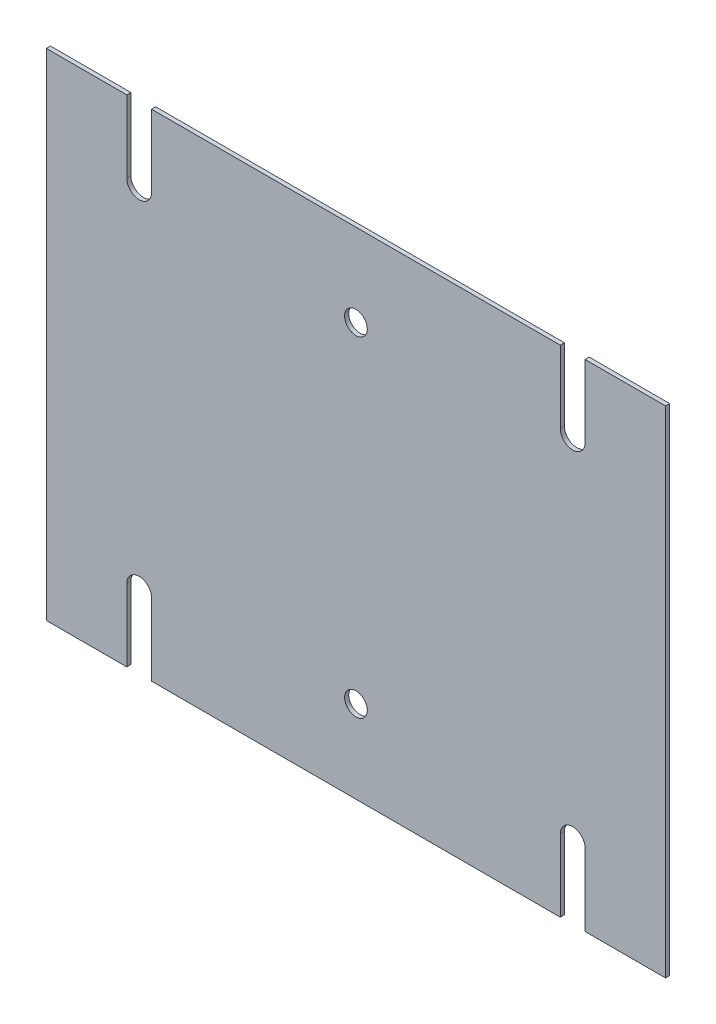
ISO-10303-21;
HEADER;
FILE_DESCRIPTION(('STEP AP214'),'2;1');
FILE_NAME('part.step','',(''),(''),'','','');
FILE_SCHEMA(('AUTOMOTIVE_DESIGN { 1 0 10303 214 1 1 1 1 }'));
ENDSEC;
DATA;
#1=APPLICATION_CONTEXT('core data for automotive mechanical design processes');
#2=APPLICATION_PROTOCOL_DEFINITION('international standard','automotive_design',2000,#1);
#3=PRODUCT_CONTEXT('',#1,'mechanical');
#4=PRODUCT('Part','Part','',(#3));
#5=PRODUCT_RELATED_PRODUCT_CATEGORY('part','',(#4));
#6=PRODUCT_DEFINITION_FORMATION('','',#4);
#7=PRODUCT_DEFINITION_CONTEXT('part definition',#1,'design');
#8=PRODUCT_DEFINITION('design','',#6,#7);
#9=PRODUCT_DEFINITION_SHAPE('','',#8);
#10=(LENGTH_UNIT() NAMED_UNIT(*) SI_UNIT(.MILLI.,.METRE.));
#11=(NAMED_UNIT(*) PLANE_ANGLE_UNIT() SI_UNIT($,.RADIAN.));
#12=(NAMED_UNIT(*) SI_UNIT($,.STERADIAN.) SOLID_ANGLE_UNIT());
#13=UNCERTAINTY_MEASURE_WITH_UNIT(LENGTH_MEASURE(1.E-05),#10,'distance_accuracy_value','');
#14=(GEOMETRIC_REPRESENTATION_CONTEXT(3) GLOBAL_UNCERTAINTY_ASSIGNED_CONTEXT((#13)) GLOBAL_UNIT_ASSIGNED_CONTEXT((#10,
#11,#12)) REPRESENTATION_CONTEXT('',''));
#15=CARTESIAN_POINT('',(0.,0.,0.));
#16=DIRECTION('',(0.,0.,1.));
#17=DIRECTION('',(1.,0.,0.));
#18=AXIS2_PLACEMENT_3D('',#15,#16,#17);
#19=CARTESIAN_POINT('',(23.9488218182788,-146.633764285917,2.));
#20=DIRECTION('',(0.,0.,1.));
#21=DIRECTION('',(1.,0.,0.));
#22=AXIS2_PLACEMENT_3D('',#19,#20,#21);
#23=PLANE('',#22);
#24=DIRECTION('',(0.,-1.,0.));
#25=VECTOR('',#24,1.);
#26=CARTESIAN_POINT('',(-231.051178181721,58.3662357140828,2.));
#27=LINE('',#26,#25);
#28=CARTESIAN_POINT('',(-231.051178181721,58.3662357140828,2.));
#29=VERTEX_POINT('',#28);
#30=CARTESIAN_POINT('',(-231.051178181721,-181.633764285917,2.));
#31=VERTEX_POINT('',#30);
#32=EDGE_CURVE('E330',#29,#31,#27,.T.);
#33=ORIENTED_EDGE('',*,*,#32,.T.);
#34=DIRECTION('',(1.,0.,0.));
#35=VECTOR('',#34,1.);
#36=CARTESIAN_POINT('',(-192.051178181721,-181.633764285917,2.));
#37=LINE('',#36,#35);
#38=CARTESIAN_POINT('',(-192.051178181721,-181.633764285917,2.));
#39=VERTEX_POINT('',#38);
#40=EDGE_CURVE('E332',#31,#39,#37,.T.);
#41=ORIENTED_EDGE('',*,*,#40,.T.);
#42=DIRECTION('',(0.,1.,0.));
#43=VECTOR('',#42,1.);
#44=CARTESIAN_POINT('',(-192.051178181721,-181.633764285917,2.));
#45=LINE('',#44,#43);
#46=CARTESIAN_POINT('',(-192.051178181721,-146.633764285917,2.));
#47=VERTEX_POINT('',#46);
#48=EDGE_CURVE('E334',#39,#47,#45,.T.);
#49=ORIENTED_EDGE('',*,*,#48,.T.);
#50=CARTESIAN_POINT('',(-186.051178181721,-146.633764285917,2.));
#51=DIRECTION('',(0.,0.,-1.));
#52=DIRECTION('',(1.,0.,0.));
#53=AXIS2_PLACEMENT_3D('',#50,#51,#52);
#54=CIRCLE('',#53,6.00000000000001);
#55=CARTESIAN_POINT('',(-180.051178181721,-146.633764285917,2.));
#56=VERTEX_POINT('',#55);
#57=EDGE_CURVE('E336',#47,#56,#54,.T.);
#58=ORIENTED_EDGE('',*,*,#57,.T.);
#59=DIRECTION('',(0.,-1.,0.));
#60=VECTOR('',#59,1.);
#61=CARTESIAN_POINT('',(-180.051178181721,-181.633764285917,2.));
#62=LINE('',#61,#60);
#63=CARTESIAN_POINT('',(-180.051178181721,-181.633764285917,2.));
#64=VERTEX_POINT('',#63);
#65=EDGE_CURVE('E338',#56,#64,#62,.T.);
#66=ORIENTED_EDGE('',*,*,#65,.T.);
#67=DIRECTION('',(1.,0.,0.));
#68=VECTOR('',#67,1.);
#69=CARTESIAN_POINT('',(17.9488218182788,-181.633764285917,2.));
#70=LINE('',#69,#68);
#71=CARTESIAN_POINT('',(17.9488218182788,-181.633764285917,2.));
#72=VERTEX_POINT('',#71);
#73=EDGE_CURVE('E340',#64,#72,#70,.T.);
#74=ORIENTED_EDGE('',*,*,#73,.T.);
#75=DIRECTION('',(0.,1.,0.));
#76=VECTOR('',#75,1.);
#77=CARTESIAN_POINT('',(17.9488218182788,-146.633764285917,2.));
#78=LINE('',#77,#76);
#79=CARTESIAN_POINT('',(17.9488218182788,-146.633764285917,2.));
#80=VERTEX_POINT('',#79);
#81=EDGE_CURVE('E187',#72,#80,#78,.T.);
#82=ORIENTED_EDGE('',*,*,#81,.T.);
#83=CARTESIAN_POINT('',(23.9488218182788,-146.633764285917,2.));
#84=DIRECTION('',(0.,0.,-1.));
#85=DIRECTION('',(1.,0.,0.));
#86=AXIS2_PLACEMENT_3D('',#83,#84,#85);
#87=CIRCLE('',#86,6.00000000000001);
#88=CARTESIAN_POINT('',(29.9488218182788,-146.633764285917,2.));
#89=VERTEX_POINT('',#88);
#90=EDGE_CURVE('E181',#80,#89,#87,.T.);
#91=ORIENTED_EDGE('',*,*,#90,.T.);
#92=DIRECTION('',(0.,-1.,0.));
#93=VECTOR('',#92,1.);
#94=CARTESIAN_POINT('',(29.9488218182788,-146.633764285917,2.));
#95=LINE('',#94,#93);
#96=CARTESIAN_POINT('',(29.9488218182788,-181.633764285917,2.));
#97=VERTEX_POINT('',#96);
#98=EDGE_CURVE('E185',#89,#97,#95,.T.);
#99=ORIENTED_EDGE('',*,*,#98,.T.);
#100=DIRECTION('',(1.,0.,0.));
#101=VECTOR('',#100,1.);
#102=CARTESIAN_POINT('',(68.9488218182788,-181.633764285917,2.));
#103=LINE('',#102,#101);
#104=CARTESIAN_POINT('',(68.9488218182788,-181.633764285917,2.));
#105=VERTEX_POINT('',#104);
#106=EDGE_CURVE('E201',#97,#105,#103,.T.);
#107=ORIENTED_EDGE('',*,*,#106,.T.);
#108=DIRECTION('',(0.,1.,0.));
#109=VECTOR('',#108,1.);
#110=CARTESIAN_POINT('',(68.9488218182787,58.3662357140828,2.));
#111=LINE('',#110,#109);
#112=CARTESIAN_POINT('',(68.9488218182787,58.3662357140828,2.));
#113=VERTEX_POINT('',#112);
#114=EDGE_CURVE('E51',#105,#113,#111,.T.);
#115=ORIENTED_EDGE('',*,*,#114,.T.);
#116=DIRECTION('',(-1.,0.,0.));
#117=VECTOR('',#116,1.);
#118=CARTESIAN_POINT('',(68.9488218182787,58.3662357140828,2.));
#119=LINE('',#118,#117);
#120=CARTESIAN_POINT('',(29.9488218182788,58.3662357140828,2.));
#121=VERTEX_POINT('',#120);
#122=EDGE_CURVE('E131',#113,#121,#119,.T.);
#123=ORIENTED_EDGE('',*,*,#122,.T.);
#124=DIRECTION('',(0.,-1.,0.));
#125=VECTOR('',#124,1.);
#126=CARTESIAN_POINT('',(29.9488218182788,58.3662357140828,2.));
#127=LINE('',#126,#125);
#128=CARTESIAN_POINT('',(29.9488218182787,23.3662357140828,2.));
#129=VERTEX_POINT('',#128);
#130=EDGE_CURVE('E296',#121,#129,#127,.T.);
#131=ORIENTED_EDGE('',*,*,#130,.T.);
#132=CARTESIAN_POINT('',(23.9488218182787,23.3662357140828,2.));
#133=DIRECTION('',(0.,0.,-1.));
#134=DIRECTION('',(1.,0.,0.));
#135=AXIS2_PLACEMENT_3D('',#132,#133,#134);
#136=CIRCLE('',#135,6.);
#137=CARTESIAN_POINT('',(17.9488218182787,23.3662357140828,2.));
#138=VERTEX_POINT('',#137);
#139=EDGE_CURVE('E316',#129,#138,#136,.T.);
#140=ORIENTED_EDGE('',*,*,#139,.T.);
#141=DIRECTION('',(0.,1.,0.));
#142=VECTOR('',#141,1.);
#143=CARTESIAN_POINT('',(17.9488218182788,58.3662357140828,2.));
#144=LINE('',#143,#142);
#145=CARTESIAN_POINT('',(17.9488218182788,58.3662357140828,2.));
#146=VERTEX_POINT('',#145);
#147=EDGE_CURVE('E313',#138,#146,#144,.T.);
#148=ORIENTED_EDGE('',*,*,#147,.T.);
#149=DIRECTION('',(-1.,0.,0.));
#150=VECTOR('',#149,1.);
#151=CARTESIAN_POINT('',(17.9488218182788,58.3662357140828,2.));
#152=LINE('',#151,#150);
#153=CARTESIAN_POINT('',(-180.051178181721,58.3662357140828,2.));
#154=VERTEX_POINT('',#153);
#155=EDGE_CURVE('E315',#146,#154,#152,.T.);
#156=ORIENTED_EDGE('',*,*,#155,.T.);
#157=DIRECTION('',(0.,-1.,0.));
#158=VECTOR('',#157,1.);
#159=CARTESIAN_POINT('',(-180.051178181721,58.3662357140828,2.));
#160=LINE('',#159,#158);
#161=CARTESIAN_POINT('',(-180.051178181721,23.3662357140828,2.));
#162=VERTEX_POINT('',#161);
#163=EDGE_CURVE('E318',#154,#162,#160,.T.);
#164=ORIENTED_EDGE('',*,*,#163,.T.);
#165=CARTESIAN_POINT('',(-186.051178181721,23.3662357140828,2.));
#166=DIRECTION('',(0.,0.,-1.));
#167=DIRECTION('',(1.,0.,0.));
#168=AXIS2_PLACEMENT_3D('',#165,#166,#167);
#169=CIRCLE('',#168,5.99999999999996);
#170=CARTESIAN_POINT('',(-192.051178181721,23.3662357140828,2.));
#171=VERTEX_POINT('',#170);
#172=EDGE_CURVE('E324',#162,#171,#169,.T.);
#173=ORIENTED_EDGE('',*,*,#172,.T.);
#174=DIRECTION('',(0.,1.,0.));
#175=VECTOR('',#174,1.);
#176=CARTESIAN_POINT('',(-192.051178181721,58.3662357140828,2.));
#177=LINE('',#176,#175);
#178=CARTESIAN_POINT('',(-192.051178181721,58.3662357140828,2.));
#179=VERTEX_POINT('',#178);
#180=EDGE_CURVE('E326',#171,#179,#177,.T.);
#181=ORIENTED_EDGE('',*,*,#180,.T.);
#182=DIRECTION('',(-1.,0.,0.));
#183=VECTOR('',#182,1.);
#184=CARTESIAN_POINT('',(-192.051178181721,58.3662357140828,2.));
#185=LINE('',#184,#183);
#186=EDGE_CURVE('E328',#179,#29,#185,.T.);
#187=ORIENTED_EDGE('',*,*,#186,.T.);
#188=EDGE_LOOP('',(#33,#41,#49,#58,#66,#74,#82,#91,#99,#107,#115,#123,#131,#140,#148,#156,#164,
#173,#181,#187));
#189=FACE_BOUND('',#188,.T.);
#190=CARTESIAN_POINT('',(-81.0511781817212,-141.633764285917,2.));
#191=DIRECTION('',(0.,0.,1.));
#192=DIRECTION('',(1.,0.,0.));
#193=AXIS2_PLACEMENT_3D('',#190,#191,#192);
#194=CIRCLE('',#193,5.5);
#195=CARTESIAN_POINT('',(-75.5511781817212,-141.633764285917,2.));
#196=VERTEX_POINT('',#195);
#197=EDGE_CURVE('E210',#196,#196,#194,.T.);
#198=ORIENTED_EDGE('',*,*,#197,.F.);
#199=EDGE_LOOP('',(#198));
#200=FACE_BOUND('',#199,.T.);
#201=CARTESIAN_POINT('',(-81.0511781817213,18.3662357140828,2.));
#202=DIRECTION('',(0.,0.,1.));
#203=DIRECTION('',(1.,0.,0.));
#204=AXIS2_PLACEMENT_3D('',#201,#202,#203);
#205=CIRCLE('',#204,5.5);
#206=CARTESIAN_POINT('',(-75.5511781817212,18.3662357140828,2.));
#207=VERTEX_POINT('',#206);
#208=EDGE_CURVE('E359',#207,#207,#205,.T.);
#209=ORIENTED_EDGE('',*,*,#208,.F.);
#210=EDGE_LOOP('',(#209));
#211=FACE_BOUND('',#210,.T.);
#212=ADVANCED_FACE('F34',(#189,#200,#211),#23,.T.);
#213=CARTESIAN_POINT('',(23.9488218182788,-146.633764285917,0.));
#214=DIRECTION('',(0.,0.,1.));
#215=DIRECTION('',(1.,0.,0.));
#216=AXIS2_PLACEMENT_3D('',#213,#214,#215);
#217=PLANE('',#216);
#218=DIRECTION('',(0.,-1.,0.));
#219=VECTOR('',#218,1.);
#220=CARTESIAN_POINT('',(-231.051178181721,-100.179856115108,0.));
#221=LINE('',#220,#219);
#222=CARTESIAN_POINT('',(-231.051178181721,58.3662357140828,0.));
#223=VERTEX_POINT('',#222);
#224=CARTESIAN_POINT('',(-231.051178181721,-181.633764285917,0.));
#225=VERTEX_POINT('',#224);
#226=EDGE_CURVE('E227',#223,#225,#221,.T.);
#227=ORIENTED_EDGE('',*,*,#226,.F.);
#228=DIRECTION('',(-1.,0.,0.));
#229=VECTOR('',#228,1.);
#230=CARTESIAN_POINT('',(-192.051178181721,58.3662357140828,0.));
#231=LINE('',#230,#229);
#232=CARTESIAN_POINT('',(-192.051178181721,58.3662357140828,0.));
#233=VERTEX_POINT('',#232);
#234=EDGE_CURVE('E224',#233,#223,#231,.T.);
#235=ORIENTED_EDGE('',*,*,#234,.F.);
#236=DIRECTION('',(0.,1.,0.));
#237=VECTOR('',#236,1.);
#238=CARTESIAN_POINT('',(-192.051178181721,58.3662357140828,0.));
#239=LINE('',#238,#237);
#240=CARTESIAN_POINT('',(-192.051178181721,23.3662357140828,0.));
#241=VERTEX_POINT('',#240);
#242=EDGE_CURVE('E222',#241,#233,#239,.T.);
#243=ORIENTED_EDGE('',*,*,#242,.F.);
#244=CARTESIAN_POINT('',(-186.051178181721,23.3662357140828,0.));
#245=DIRECTION('',(0.,0.,-1.));
#246=DIRECTION('',(1.,0.,0.));
#247=AXIS2_PLACEMENT_3D('',#244,#245,#246);
#248=CIRCLE('',#247,5.99999999999996);
#249=CARTESIAN_POINT('',(-180.051178181721,23.3662357140828,0.));
#250=VERTEX_POINT('',#249);
#251=EDGE_CURVE('E220',#250,#241,#248,.T.);
#252=ORIENTED_EDGE('',*,*,#251,.F.);
#253=DIRECTION('',(0.,-1.,0.));
#254=VECTOR('',#253,1.);
#255=CARTESIAN_POINT('',(-180.051178181721,58.3662357140828,0.));
#256=LINE('',#255,#254);
#257=CARTESIAN_POINT('',(-180.051178181721,58.3662357140828,0.));
#258=VERTEX_POINT('',#257);
#259=EDGE_CURVE('E218',#258,#250,#256,.T.);
#260=ORIENTED_EDGE('',*,*,#259,.F.);
#261=DIRECTION('',(-1.,0.,0.));
#262=VECTOR('',#261,1.);
#263=CARTESIAN_POINT('',(17.9488218182788,58.3662357140828,0.));
#264=LINE('',#263,#262);
#265=CARTESIAN_POINT('',(17.9488218182788,58.3662357140828,0.));
#266=VERTEX_POINT('',#265);
#267=EDGE_CURVE('E216',#266,#258,#264,.T.);
#268=ORIENTED_EDGE('',*,*,#267,.F.);
#269=DIRECTION('',(0.,1.,0.));
#270=VECTOR('',#269,1.);
#271=CARTESIAN_POINT('',(17.9488218182788,58.3662357140828,0.));
#272=LINE('',#271,#270);
#273=CARTESIAN_POINT('',(17.9488218182787,23.3662357140828,0.));
#274=VERTEX_POINT('',#273);
#275=EDGE_CURVE('E214',#274,#266,#272,.T.);
#276=ORIENTED_EDGE('',*,*,#275,.F.);
#277=CARTESIAN_POINT('',(23.9488218182787,23.3662357140828,0.));
#278=DIRECTION('',(0.,0.,-1.));
#279=DIRECTION('',(1.,0.,0.));
#280=AXIS2_PLACEMENT_3D('',#277,#278,#279);
#281=CIRCLE('',#280,6.);
#282=CARTESIAN_POINT('',(29.9488218182787,23.3662357140828,0.));
#283=VERTEX_POINT('',#282);
#284=EDGE_CURVE('E212',#283,#274,#281,.T.);
#285=ORIENTED_EDGE('',*,*,#284,.F.);
#286=DIRECTION('',(0.,-1.,0.));
#287=VECTOR('',#286,1.);
#288=CARTESIAN_POINT('',(29.9488218182788,58.3662357140828,0.));
#289=LINE('',#288,#287);
#290=CARTESIAN_POINT('',(29.9488218182788,58.3662357140828,0.));
#291=VERTEX_POINT('',#290);
#292=EDGE_CURVE('E209',#291,#283,#289,.T.);
#293=ORIENTED_EDGE('',*,*,#292,.F.);
#294=DIRECTION('',(-1.,0.,0.));
#295=VECTOR('',#294,1.);
#296=CARTESIAN_POINT('',(68.9488218182787,58.3662357140828,0.));
#297=LINE('',#296,#295);
#298=CARTESIAN_POINT('',(68.9488218182787,58.3662357140828,0.));
#299=VERTEX_POINT('',#298);
#300=EDGE_CURVE('E207',#299,#291,#297,.T.);
#301=ORIENTED_EDGE('',*,*,#300,.F.);
#302=DIRECTION('',(0.,1.,0.));
#303=VECTOR('',#302,1.);
#304=CARTESIAN_POINT('',(68.9488218182788,-96.6337642859173,0.));
#305=LINE('',#304,#303);
#306=CARTESIAN_POINT('',(68.9488218182788,-181.633764285917,0.));
#307=VERTEX_POINT('',#306);
#308=EDGE_CURVE('E244',#307,#299,#305,.T.);
#309=ORIENTED_EDGE('',*,*,#308,.F.);
#310=DIRECTION('',(1.,0.,0.));
#311=VECTOR('',#310,1.);
#312=CARTESIAN_POINT('',(68.9488218182788,-181.633764285917,0.));
#313=LINE('',#312,#311);
#314=CARTESIAN_POINT('',(29.9488218182788,-181.633764285917,0.));
#315=VERTEX_POINT('',#314);
#316=EDGE_CURVE('E124',#315,#307,#313,.T.);
#317=ORIENTED_EDGE('',*,*,#316,.F.);
#318=DIRECTION('',(0.,-1.,0.));
#319=VECTOR('',#318,1.);
#320=CARTESIAN_POINT('',(29.9488218182788,-146.633764285917,0.));
#321=LINE('',#320,#319);
#322=CARTESIAN_POINT('',(29.9488218182788,-146.633764285917,0.));
#323=VERTEX_POINT('',#322);
#324=EDGE_CURVE('E117',#323,#315,#321,.T.);
#325=ORIENTED_EDGE('',*,*,#324,.F.);
#326=CARTESIAN_POINT('',(23.9488218182788,-146.633764285917,0.));
#327=DIRECTION('',(0.,0.,-1.));
#328=DIRECTION('',(1.,0.,0.));
#329=AXIS2_PLACEMENT_3D('',#326,#327,#328);
#330=CIRCLE('',#329,6.00000000000001);
#331=CARTESIAN_POINT('',(17.9488218182788,-146.633764285917,0.));
#332=VERTEX_POINT('',#331);
#333=EDGE_CURVE('E195',#332,#323,#330,.T.);
#334=ORIENTED_EDGE('',*,*,#333,.F.);
#335=DIRECTION('',(0.,1.,0.));
#336=VECTOR('',#335,1.);
#337=CARTESIAN_POINT('',(17.9488218182788,-146.633764285917,0.));
#338=LINE('',#337,#336);
#339=CARTESIAN_POINT('',(17.9488218182788,-181.633764285917,0.));
#340=VERTEX_POINT('',#339);
#341=EDGE_CURVE('E239',#340,#332,#338,.T.);
#342=ORIENTED_EDGE('',*,*,#341,.F.);
#343=DIRECTION('',(1.,0.,0.));
#344=VECTOR('',#343,1.);
#345=CARTESIAN_POINT('',(17.9488218182788,-181.633764285917,0.));
#346=LINE('',#345,#344);
#347=CARTESIAN_POINT('',(-180.051178181721,-181.633764285917,0.));
#348=VERTEX_POINT('',#347);
#349=EDGE_CURVE('E237',#348,#340,#346,.T.);
#350=ORIENTED_EDGE('',*,*,#349,.F.);
#351=DIRECTION('',(0.,-1.,0.));
#352=VECTOR('',#351,1.);
#353=CARTESIAN_POINT('',(-180.051178181721,-181.633764285917,0.));
#354=LINE('',#353,#352);
#355=CARTESIAN_POINT('',(-180.051178181721,-146.633764285917,0.));
#356=VERTEX_POINT('',#355);
#357=EDGE_CURVE('E235',#356,#348,#354,.T.);
#358=ORIENTED_EDGE('',*,*,#357,.F.);
#359=CARTESIAN_POINT('',(-186.051178181721,-146.633764285917,0.));
#360=DIRECTION('',(0.,0.,-1.));
#361=DIRECTION('',(1.,0.,0.));
#362=AXIS2_PLACEMENT_3D('',#359,#360,#361);
#363=CIRCLE('',#362,6.00000000000001);
#364=CARTESIAN_POINT('',(-192.051178181721,-146.633764285917,0.));
#365=VERTEX_POINT('',#364);
#366=EDGE_CURVE('E233',#365,#356,#363,.T.);
#367=ORIENTED_EDGE('',*,*,#366,.F.);
#368=DIRECTION('',(0.,1.,0.));
#369=VECTOR('',#368,1.);
#370=CARTESIAN_POINT('',(-192.051178181721,-181.633764285917,0.));
#371=LINE('',#370,#369);
#372=CARTESIAN_POINT('',(-192.051178181721,-181.633764285917,0.));
#373=VERTEX_POINT('',#372);
#374=EDGE_CURVE('E231',#373,#365,#371,.T.);
#375=ORIENTED_EDGE('',*,*,#374,.F.);
#376=DIRECTION('',(1.,0.,0.));
#377=VECTOR('',#376,1.);
#378=CARTESIAN_POINT('',(-192.051178181721,-181.633764285917,0.));
#379=LINE('',#378,#377);
#380=EDGE_CURVE('E229',#225,#373,#379,.T.);
#381=ORIENTED_EDGE('',*,*,#380,.F.);
#382=EDGE_LOOP('',(#227,#235,#243,#252,#260,#268,#276,#285,#293,#301,#309,#317,#325,#334,#342,
#350,#358,#367,#375,#381));
#383=FACE_BOUND('',#382,.T.);
#384=CARTESIAN_POINT('',(-81.0511781817212,-141.633764285917,0.));
#385=DIRECTION('',(0.,0.,1.));
#386=DIRECTION('',(1.,0.,0.));
#387=AXIS2_PLACEMENT_3D('',#384,#385,#386);
#388=CIRCLE('',#387,5.5);
#389=CARTESIAN_POINT('',(-75.5511781817212,-141.633764285917,0.));
#390=VERTEX_POINT('',#389);
#391=EDGE_CURVE('E356',#390,#390,#388,.T.);
#392=ORIENTED_EDGE('',*,*,#391,.T.);
#393=EDGE_LOOP('',(#392));
#394=FACE_BOUND('',#393,.T.);
#395=CARTESIAN_POINT('',(-81.0511781817213,18.3662357140828,0.));
#396=DIRECTION('',(0.,0.,1.));
#397=DIRECTION('',(1.,0.,0.));
#398=AXIS2_PLACEMENT_3D('',#395,#396,#397);
#399=CIRCLE('',#398,5.5);
#400=CARTESIAN_POINT('',(-75.5511781817212,18.3662357140828,0.));
#401=VERTEX_POINT('',#400);
#402=EDGE_CURVE('E362',#401,#401,#399,.T.);
#403=ORIENTED_EDGE('',*,*,#402,.T.);
#404=EDGE_LOOP('',(#403));
#405=FACE_BOUND('',#404,.T.);
#406=ADVANCED_FACE('F300',(#383,#394,#405),#217,.F.);
#407=CARTESIAN_POINT('',(68.9488218182787,58.3662357140828,2.));
#408=DIRECTION('',(0.,-1.,0.));
#409=DIRECTION('',(1.,0.,0.));
#410=AXIS2_PLACEMENT_3D('',#407,#408,#409);
#411=PLANE('',#410);
#412=ORIENTED_EDGE('',*,*,#300,.T.);
#413=DIRECTION('',(0.,0.,-1.));
#414=VECTOR('',#413,1.);
#415=CARTESIAN_POINT('',(29.9488218182788,58.3662357140828,2.));
#416=LINE('',#415,#414);
#417=EDGE_CURVE('E43',#121,#291,#416,.T.);
#418=ORIENTED_EDGE('',*,*,#417,.F.);
#419=ORIENTED_EDGE('',*,*,#122,.F.);
#420=DIRECTION('',(0.,0.,-1.));
#421=VECTOR('',#420,1.);
#422=CARTESIAN_POINT('',(68.9488218182787,58.3662357140828,2.));
#423=LINE('',#422,#421);
#424=EDGE_CURVE('E11',#113,#299,#423,.T.);
#425=ORIENTED_EDGE('',*,*,#424,.T.);
#426=EDGE_LOOP('',(#412,#418,#419,#425));
#427=FACE_BOUND('',#426,.T.);
#428=ADVANCED_FACE('F36',(#427),#411,.F.);
#429=CARTESIAN_POINT('',(29.9488218182788,58.3662357140828,2.));
#430=DIRECTION('',(1.,0.,0.));
#431=DIRECTION('',(0.,1.,0.));
#432=AXIS2_PLACEMENT_3D('',#429,#430,#431);
#433=PLANE('',#432);
#434=ORIENTED_EDGE('',*,*,#292,.T.);
#435=DIRECTION('',(0.,0.,-1.));
#436=VECTOR('',#435,1.);
#437=CARTESIAN_POINT('',(29.9488218182787,23.3662357140828,2.));
#438=LINE('',#437,#436);
#439=EDGE_CURVE('E288',#129,#283,#438,.T.);
#440=ORIENTED_EDGE('',*,*,#439,.F.);
#441=ORIENTED_EDGE('',*,*,#130,.F.);
#442=ORIENTED_EDGE('',*,*,#417,.T.);
#443=EDGE_LOOP('',(#434,#440,#441,#442));
#444=FACE_BOUND('',#443,.T.);
#445=ADVANCED_FACE('F294',(#444),#433,.F.);
#446=CARTESIAN_POINT('',(23.9488218182787,23.3662357140828,2.));
#447=DIRECTION('',(0.,0.,-1.));
#448=DIRECTION('',(-1.,0.,0.));
#449=AXIS2_PLACEMENT_3D('',#446,#447,#448);
#450=CYLINDRICAL_SURFACE('',#449,6.);
#451=ORIENTED_EDGE('',*,*,#284,.T.);
#452=DIRECTION('',(0.,0.,-1.));
#453=VECTOR('',#452,1.);
#454=CARTESIAN_POINT('',(17.9488218182787,23.3662357140828,2.));
#455=LINE('',#454,#453);
#456=EDGE_CURVE('E285',#138,#274,#455,.T.);
#457=ORIENTED_EDGE('',*,*,#456,.F.);
#458=ORIENTED_EDGE('',*,*,#139,.F.);
#459=ORIENTED_EDGE('',*,*,#439,.T.);
#460=EDGE_LOOP('',(#451,#457,#458,#459));
#461=FACE_BOUND('',#460,.T.);
#462=ADVANCED_FACE('F307',(#461),#450,.F.);
#463=CARTESIAN_POINT('',(17.9488218182788,58.3662357140828,2.));
#464=DIRECTION('',(-1.,0.,0.));
#465=DIRECTION('',(0.,-1.,0.));
#466=AXIS2_PLACEMENT_3D('',#463,#464,#465);
#467=PLANE('',#466);
#468=ORIENTED_EDGE('',*,*,#275,.T.);
#469=DIRECTION('',(0.,0.,-1.));
#470=VECTOR('',#469,1.);
#471=CARTESIAN_POINT('',(17.9488218182788,58.3662357140828,2.));
#472=LINE('',#471,#470);
#473=EDGE_CURVE('E282',#146,#266,#472,.T.);
#474=ORIENTED_EDGE('',*,*,#473,.F.);
#475=ORIENTED_EDGE('',*,*,#147,.F.);
#476=ORIENTED_EDGE('',*,*,#456,.T.);
#477=EDGE_LOOP('',(#468,#474,#475,#476));
#478=FACE_BOUND('',#477,.T.);
#479=ADVANCED_FACE('F311',(#478),#467,.F.);
#480=CARTESIAN_POINT('',(17.9488218182788,58.3662357140828,2.));
#481=DIRECTION('',(0.,-1.,0.));
#482=DIRECTION('',(1.,0.,0.));
#483=AXIS2_PLACEMENT_3D('',#480,#481,#482);
#484=PLANE('',#483);
#485=ORIENTED_EDGE('',*,*,#267,.T.);
#486=DIRECTION('',(0.,0.,-1.));
#487=VECTOR('',#486,1.);
#488=CARTESIAN_POINT('',(-180.051178181721,58.3662357140828,2.));
#489=LINE('',#488,#487);
#490=EDGE_CURVE('E279',#154,#258,#489,.T.);
#491=ORIENTED_EDGE('',*,*,#490,.F.);
#492=ORIENTED_EDGE('',*,*,#155,.F.);
#493=ORIENTED_EDGE('',*,*,#473,.T.);
#494=EDGE_LOOP('',(#485,#491,#492,#493));
#495=FACE_BOUND('',#494,.T.);
#496=ADVANCED_FACE('F428',(#495),#484,.F.);
#497=CARTESIAN_POINT('',(-180.051178181721,58.3662357140828,2.));
#498=DIRECTION('',(1.,0.,0.));
#499=DIRECTION('',(0.,0.,-1.));
#500=AXIS2_PLACEMENT_3D('',#497,#498,#499);
#501=PLANE('',#500);
#502=ORIENTED_EDGE('',*,*,#259,.T.);
#503=DIRECTION('',(0.,0.,-1.));
#504=VECTOR('',#503,1.);
#505=CARTESIAN_POINT('',(-180.051178181721,23.3662357140828,2.));
#506=LINE('',#505,#504);
#507=EDGE_CURVE('E276',#162,#250,#506,.T.);
#508=ORIENTED_EDGE('',*,*,#507,.F.);
#509=ORIENTED_EDGE('',*,*,#163,.F.);
#510=ORIENTED_EDGE('',*,*,#490,.T.);
#511=EDGE_LOOP('',(#502,#508,#509,#510));
#512=FACE_BOUND('',#511,.T.);
#513=ADVANCED_FACE('F424',(#512),#501,.F.);
#514=CARTESIAN_POINT('',(-186.051178181721,23.3662357140828,2.));
#515=DIRECTION('',(0.,0.,-1.));
#516=DIRECTION('',(-1.,0.,0.));
#517=AXIS2_PLACEMENT_3D('',#514,#515,#516);
#518=CYLINDRICAL_SURFACE('',#517,5.99999999999996);
#519=ORIENTED_EDGE('',*,*,#251,.T.);
#520=DIRECTION('',(0.,0.,-1.));
#521=VECTOR('',#520,1.);
#522=CARTESIAN_POINT('',(-192.051178181721,23.3662357140828,2.));
#523=LINE('',#522,#521);
#524=EDGE_CURVE('E273',#171,#241,#523,.T.);
#525=ORIENTED_EDGE('',*,*,#524,.F.);
#526=ORIENTED_EDGE('',*,*,#172,.F.);
#527=ORIENTED_EDGE('',*,*,#507,.T.);
#528=EDGE_LOOP('',(#519,#525,#526,#527));
#529=FACE_BOUND('',#528,.T.);
#530=ADVANCED_FACE('F420',(#529),#518,.F.);
#531=CARTESIAN_POINT('',(-192.051178181721,58.3662357140828,2.));
#532=DIRECTION('',(-1.,0.,0.));
#533=DIRECTION('',(0.,-1.,0.));
#534=AXIS2_PLACEMENT_3D('',#531,#532,#533);
#535=PLANE('',#534);
#536=ORIENTED_EDGE('',*,*,#242,.T.);
#537=DIRECTION('',(0.,0.,-1.));
#538=VECTOR('',#537,1.);
#539=CARTESIAN_POINT('',(-192.051178181721,58.3662357140828,2.));
#540=LINE('',#539,#538);
#541=EDGE_CURVE('E270',#179,#233,#540,.T.);
#542=ORIENTED_EDGE('',*,*,#541,.F.);
#543=ORIENTED_EDGE('',*,*,#180,.F.);
#544=ORIENTED_EDGE('',*,*,#524,.T.);
#545=EDGE_LOOP('',(#536,#542,#543,#544));
#546=FACE_BOUND('',#545,.T.);
#547=ADVANCED_FACE('F416',(#546),#535,.F.);
#548=CARTESIAN_POINT('',(-192.051178181721,58.3662357140828,2.));
#549=DIRECTION('',(0.,-1.,0.));
#550=DIRECTION('',(0.,0.,-1.));
#551=AXIS2_PLACEMENT_3D('',#548,#549,#550);
#552=PLANE('',#551);
#553=ORIENTED_EDGE('',*,*,#234,.T.);
#554=DIRECTION('',(0.,0.,-1.));
#555=VECTOR('',#554,1.);
#556=CARTESIAN_POINT('',(-231.051178181721,58.3662357140828,2.));
#557=LINE('',#556,#555);
#558=EDGE_CURVE('E267',#29,#223,#557,.T.);
#559=ORIENTED_EDGE('',*,*,#558,.F.);
#560=ORIENTED_EDGE('',*,*,#186,.F.);
#561=ORIENTED_EDGE('',*,*,#541,.T.);
#562=EDGE_LOOP('',(#553,#559,#560,#561));
#563=FACE_BOUND('',#562,.T.);
#564=ADVANCED_FACE('F412',(#563),#552,.F.);
#565=CARTESIAN_POINT('',(-231.051178181721,-100.179856115108,2.));
#566=DIRECTION('',(1.,0.,0.));
#567=DIRECTION('',(0.,1.,0.));
#568=AXIS2_PLACEMENT_3D('',#565,#566,#567);
#569=PLANE('',#568);
#570=ORIENTED_EDGE('',*,*,#226,.T.);
#571=DIRECTION('',(0.,0.,-1.));
#572=VECTOR('',#571,1.);
#573=CARTESIAN_POINT('',(-231.051178181721,-181.633764285917,2.));
#574=LINE('',#573,#572);
#575=EDGE_CURVE('E264',#31,#225,#574,.T.);
#576=ORIENTED_EDGE('',*,*,#575,.F.);
#577=ORIENTED_EDGE('',*,*,#32,.F.);
#578=ORIENTED_EDGE('',*,*,#558,.T.);
#579=EDGE_LOOP('',(#570,#576,#577,#578));
#580=FACE_BOUND('',#579,.T.);
#581=ADVANCED_FACE('F408',(#580),#569,.F.);
#582=CARTESIAN_POINT('',(-192.051178181721,-181.633764285917,2.));
#583=DIRECTION('',(0.,1.,0.));
#584=DIRECTION('',(0.,0.,1.));
#585=AXIS2_PLACEMENT_3D('',#582,#583,#584);
#586=PLANE('',#585);
#587=ORIENTED_EDGE('',*,*,#380,.T.);
#588=DIRECTION('',(0.,0.,-1.));
#589=VECTOR('',#588,1.);
#590=CARTESIAN_POINT('',(-192.051178181721,-181.633764285917,2.));
#591=LINE('',#590,#589);
#592=EDGE_CURVE('E261',#39,#373,#591,.T.);
#593=ORIENTED_EDGE('',*,*,#592,.F.);
#594=ORIENTED_EDGE('',*,*,#40,.F.);
#595=ORIENTED_EDGE('',*,*,#575,.T.);
#596=EDGE_LOOP('',(#587,#593,#594,#595));
#597=FACE_BOUND('',#596,.T.);
#598=ADVANCED_FACE('F404',(#597),#586,.F.);
#599=CARTESIAN_POINT('',(-192.051178181721,-181.633764285917,2.));
#600=DIRECTION('',(-1.,0.,0.));
#601=DIRECTION('',(0.,0.,1.));
#602=AXIS2_PLACEMENT_3D('',#599,#600,#601);
#603=PLANE('',#602);
#604=ORIENTED_EDGE('',*,*,#374,.T.);
#605=DIRECTION('',(0.,0.,-1.));
#606=VECTOR('',#605,1.);
#607=CARTESIAN_POINT('',(-192.051178181721,-146.633764285917,2.));
#608=LINE('',#607,#606);
#609=EDGE_CURVE('E258',#47,#365,#608,.T.);
#610=ORIENTED_EDGE('',*,*,#609,.F.);
#611=ORIENTED_EDGE('',*,*,#48,.F.);
#612=ORIENTED_EDGE('',*,*,#592,.T.);
#613=EDGE_LOOP('',(#604,#610,#611,#612));
#614=FACE_BOUND('',#613,.T.);
#615=ADVANCED_FACE('F400',(#614),#603,.F.);
#616=CARTESIAN_POINT('',(-186.051178181721,-146.633764285917,2.));
#617=DIRECTION('',(0.,0.,-1.));
#618=DIRECTION('',(-1.,0.,0.));
#619=AXIS2_PLACEMENT_3D('',#616,#617,#618);
#620=CYLINDRICAL_SURFACE('',#619,6.00000000000001);
#621=ORIENTED_EDGE('',*,*,#366,.T.);
#622=DIRECTION('',(0.,0.,-1.));
#623=VECTOR('',#622,1.);
#624=CARTESIAN_POINT('',(-180.051178181721,-146.633764285917,2.));
#625=LINE('',#624,#623);
#626=EDGE_CURVE('E255',#56,#356,#625,.T.);
#627=ORIENTED_EDGE('',*,*,#626,.F.);
#628=ORIENTED_EDGE('',*,*,#57,.F.);
#629=ORIENTED_EDGE('',*,*,#609,.T.);
#630=EDGE_LOOP('',(#621,#627,#628,#629));
#631=FACE_BOUND('',#630,.T.);
#632=ADVANCED_FACE('F396',(#631),#620,.F.);
#633=CARTESIAN_POINT('',(-180.051178181721,-181.633764285917,2.));
#634=DIRECTION('',(1.,0.,0.));
#635=DIRECTION('',(0.,0.,-1.));
#636=AXIS2_PLACEMENT_3D('',#633,#634,#635);
#637=PLANE('',#636);
#638=ORIENTED_EDGE('',*,*,#357,.T.);
#639=DIRECTION('',(0.,0.,-1.));
#640=VECTOR('',#639,1.);
#641=CARTESIAN_POINT('',(-180.051178181721,-181.633764285917,2.));
#642=LINE('',#641,#640);
#643=EDGE_CURVE('E252',#64,#348,#642,.T.);
#644=ORIENTED_EDGE('',*,*,#643,.F.);
#645=ORIENTED_EDGE('',*,*,#65,.F.);
#646=ORIENTED_EDGE('',*,*,#626,.T.);
#647=EDGE_LOOP('',(#638,#644,#645,#646));
#648=FACE_BOUND('',#647,.T.);
#649=ADVANCED_FACE('F393',(#648),#637,.F.);
#650=CARTESIAN_POINT('',(17.9488218182788,-181.633764285917,2.));
#651=DIRECTION('',(0.,1.,0.));
#652=DIRECTION('',(-1.,0.,0.));
#653=AXIS2_PLACEMENT_3D('',#650,#651,#652);
#654=PLANE('',#653);
#655=ORIENTED_EDGE('',*,*,#349,.T.);
#656=DIRECTION('',(0.,0.,-1.));
#657=VECTOR('',#656,1.);
#658=CARTESIAN_POINT('',(17.9488218182788,-181.633764285917,2.));
#659=LINE('',#658,#657);
#660=EDGE_CURVE('E249',#72,#340,#659,.T.);
#661=ORIENTED_EDGE('',*,*,#660,.F.);
#662=ORIENTED_EDGE('',*,*,#73,.F.);
#663=ORIENTED_EDGE('',*,*,#643,.T.);
#664=EDGE_LOOP('',(#655,#661,#662,#663));
#665=FACE_BOUND('',#664,.T.);
#666=ADVANCED_FACE('F346',(#665),#654,.F.);
#667=CARTESIAN_POINT('',(17.9488218182788,-146.633764285917,2.));
#668=DIRECTION('',(-1.,0.,0.));
#669=DIRECTION('',(0.,-1.,0.));
#670=AXIS2_PLACEMENT_3D('',#667,#668,#669);
#671=PLANE('',#670);
#672=ORIENTED_EDGE('',*,*,#341,.T.);
#673=DIRECTION('',(0.,0.,-1.));
#674=VECTOR('',#673,1.);
#675=CARTESIAN_POINT('',(17.9488218182788,-146.633764285917,2.));
#676=LINE('',#675,#674);
#677=EDGE_CURVE('E196',#80,#332,#676,.T.);
#678=ORIENTED_EDGE('',*,*,#677,.F.);
#679=ORIENTED_EDGE('',*,*,#81,.F.);
#680=ORIENTED_EDGE('',*,*,#660,.T.);
#681=EDGE_LOOP('',(#672,#678,#679,#680));
#682=FACE_BOUND('',#681,.T.);
#683=ADVANCED_FACE('F350',(#682),#671,.F.);
#684=CARTESIAN_POINT('',(23.9488218182788,-146.633764285917,2.));
#685=DIRECTION('',(0.,0.,-1.));
#686=DIRECTION('',(-1.,0.,0.));
#687=AXIS2_PLACEMENT_3D('',#684,#685,#686);
#688=CYLINDRICAL_SURFACE('',#687,6.00000000000001);
#689=ORIENTED_EDGE('',*,*,#333,.T.);
#690=DIRECTION('',(0.,0.,-1.));
#691=VECTOR('',#690,1.);
#692=CARTESIAN_POINT('',(29.9488218182788,-146.633764285917,2.));
#693=LINE('',#692,#691);
#694=EDGE_CURVE('E192',#89,#323,#693,.T.);
#695=ORIENTED_EDGE('',*,*,#694,.F.);
#696=ORIENTED_EDGE('',*,*,#90,.F.);
#697=ORIENTED_EDGE('',*,*,#677,.T.);
#698=EDGE_LOOP('',(#689,#695,#696,#697));
#699=FACE_BOUND('',#698,.T.);
#700=ADVANCED_FACE('F193',(#699),#688,.F.);
#701=CARTESIAN_POINT('',(29.9488218182788,-146.633764285917,2.));
#702=DIRECTION('',(1.,0.,0.));
#703=DIRECTION('',(0.,1.,0.));
#704=AXIS2_PLACEMENT_3D('',#701,#702,#703);
#705=PLANE('',#704);
#706=ORIENTED_EDGE('',*,*,#324,.T.);
#707=DIRECTION('',(0.,0.,-1.));
#708=VECTOR('',#707,1.);
#709=CARTESIAN_POINT('',(29.9488218182788,-181.633764285917,2.));
#710=LINE('',#709,#708);
#711=EDGE_CURVE('E197',#97,#315,#710,.T.);
#712=ORIENTED_EDGE('',*,*,#711,.F.);
#713=ORIENTED_EDGE('',*,*,#98,.F.);
#714=ORIENTED_EDGE('',*,*,#694,.T.);
#715=EDGE_LOOP('',(#706,#712,#713,#714));
#716=FACE_BOUND('',#715,.T.);
#717=ADVANCED_FACE('F199',(#716),#705,.F.);
#718=CARTESIAN_POINT('',(68.9488218182788,-181.633764285917,2.));
#719=DIRECTION('',(0.,1.,0.));
#720=DIRECTION('',(0.,0.,1.));
#721=AXIS2_PLACEMENT_3D('',#718,#719,#720);
#722=PLANE('',#721);
#723=ORIENTED_EDGE('',*,*,#316,.T.);
#724=DIRECTION('',(0.,0.,-1.));
#725=VECTOR('',#724,1.);
#726=CARTESIAN_POINT('',(68.9488218182788,-181.633764285917,2.));
#727=LINE('',#726,#725);
#728=EDGE_CURVE('E203',#105,#307,#727,.T.);
#729=ORIENTED_EDGE('',*,*,#728,.F.);
#730=ORIENTED_EDGE('',*,*,#106,.F.);
#731=ORIENTED_EDGE('',*,*,#711,.T.);
#732=EDGE_LOOP('',(#723,#729,#730,#731));
#733=FACE_BOUND('',#732,.T.);
#734=ADVANCED_FACE('F352',(#733),#722,.F.);
#735=CARTESIAN_POINT('',(68.9488218182788,-96.6337642859173,2.));
#736=DIRECTION('',(-1.,0.,0.));
#737=DIRECTION('',(0.,0.,1.));
#738=AXIS2_PLACEMENT_3D('',#735,#736,#737);
#739=PLANE('',#738);
#740=ORIENTED_EDGE('',*,*,#308,.T.);
#741=ORIENTED_EDGE('',*,*,#424,.F.);
#742=ORIENTED_EDGE('',*,*,#114,.F.);
#743=ORIENTED_EDGE('',*,*,#728,.T.);
#744=EDGE_LOOP('',(#740,#741,#742,#743));
#745=FACE_BOUND('',#744,.T.);
#746=ADVANCED_FACE('F351',(#745),#739,.F.);
#747=CARTESIAN_POINT('',(-81.0511781817212,-141.633764285917,2.));
#748=DIRECTION('',(0.,0.,-1.));
#749=DIRECTION('',(-1.,0.,0.));
#750=AXIS2_PLACEMENT_3D('',#747,#748,#749);
#751=CYLINDRICAL_SURFACE('',#750,5.5);
#752=ORIENTED_EDGE('',*,*,#197,.T.);
#753=EDGE_LOOP('',(#752));
#754=FACE_BOUND('',#753,.T.);
#755=ORIENTED_EDGE('',*,*,#391,.F.);
#756=EDGE_LOOP('',(#755));
#757=FACE_BOUND('',#756,.T.);
#758=ADVANCED_FACE('F378',(#754,#757),#751,.F.);
#759=CARTESIAN_POINT('',(-81.0511781817213,18.3662357140828,2.));
#760=DIRECTION('',(0.,0.,-1.));
#761=DIRECTION('',(-1.,0.,0.));
#762=AXIS2_PLACEMENT_3D('',#759,#760,#761);
#763=CYLINDRICAL_SURFACE('',#762,5.5);
#764=ORIENTED_EDGE('',*,*,#208,.T.);
#765=EDGE_LOOP('',(#764));
#766=FACE_BOUND('',#765,.T.);
#767=ORIENTED_EDGE('',*,*,#402,.F.);
#768=EDGE_LOOP('',(#767));
#769=FACE_BOUND('',#768,.T.);
#770=ADVANCED_FACE('F368',(#766,#769),#763,.F.);
#771=CLOSED_SHELL('',(#212,#406,#428,#445,#462,#479,#496,#513,#530,#547,#564,#581,#598,#615,
#632,#649,#666,#683,#700,#717,#734,#746,#758,#770));
#772=MANIFOLD_SOLID_BREP('B2',#771);
#773=ADVANCED_BREP_SHAPE_REPRESENTATION('',(#18,#772),#14);
#774=SHAPE_DEFINITION_REPRESENTATION(#9,#773);
ENDSEC;
END-ISO-10303-21;
